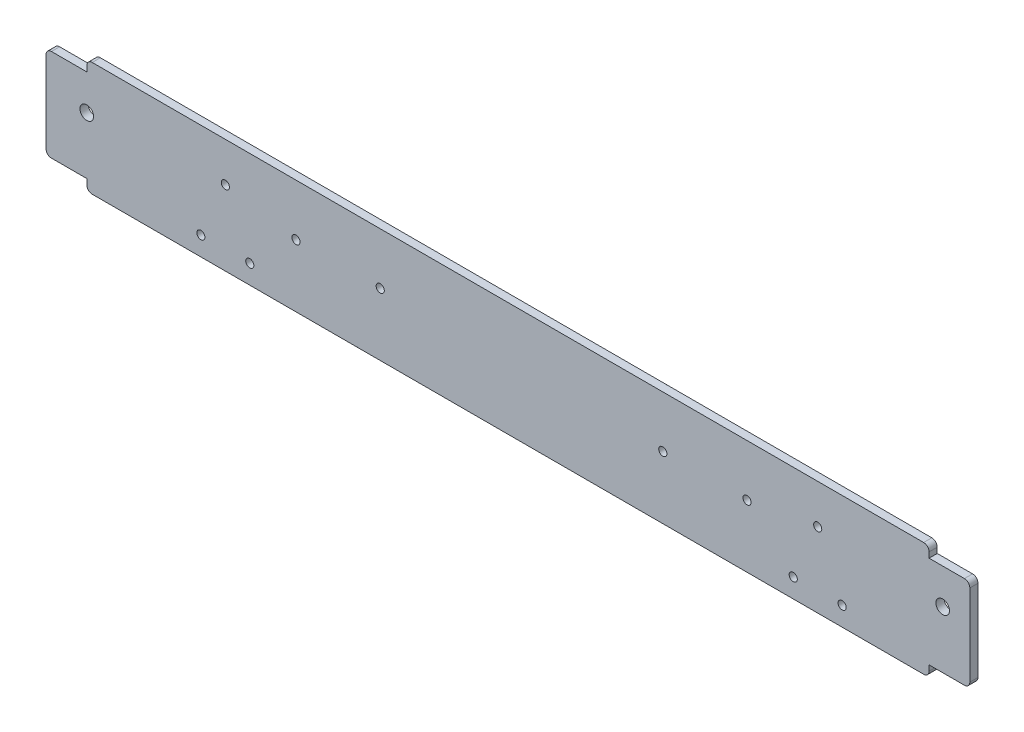
ISO-10303-21;
HEADER;
FILE_DESCRIPTION(('STEP AP214'),'2;1');
FILE_NAME('part.step','',(''),(''),'','','');
FILE_SCHEMA(('AUTOMOTIVE_DESIGN { 1 0 10303 214 1 1 1 1 }'));
ENDSEC;
DATA;
#1=APPLICATION_CONTEXT('core data for automotive mechanical design processes');
#2=APPLICATION_PROTOCOL_DEFINITION('international standard','automotive_design',2000,#1);
#3=PRODUCT_CONTEXT('',#1,'mechanical');
#4=PRODUCT('Part','Part','',(#3));
#5=PRODUCT_RELATED_PRODUCT_CATEGORY('part','',(#4));
#6=PRODUCT_DEFINITION_FORMATION('','',#4);
#7=PRODUCT_DEFINITION_CONTEXT('part definition',#1,'design');
#8=PRODUCT_DEFINITION('design','',#6,#7);
#9=PRODUCT_DEFINITION_SHAPE('','',#8);
#10=(LENGTH_UNIT() NAMED_UNIT(*) SI_UNIT(.MILLI.,.METRE.));
#11=(NAMED_UNIT(*) PLANE_ANGLE_UNIT() SI_UNIT($,.RADIAN.));
#12=(NAMED_UNIT(*) SI_UNIT($,.STERADIAN.) SOLID_ANGLE_UNIT());
#13=UNCERTAINTY_MEASURE_WITH_UNIT(LENGTH_MEASURE(1.E-05),#10,'distance_accuracy_value','');
#14=(GEOMETRIC_REPRESENTATION_CONTEXT(3) GLOBAL_UNCERTAINTY_ASSIGNED_CONTEXT((#13)) GLOBAL_UNIT_ASSIGNED_CONTEXT((#10,
#11,#12)) REPRESENTATION_CONTEXT('',''));
#15=CARTESIAN_POINT('',(0.,0.,0.));
#16=DIRECTION('',(0.,0.,1.));
#17=DIRECTION('',(1.,0.,0.));
#18=AXIS2_PLACEMENT_3D('',#15,#16,#17);
#19=CARTESIAN_POINT('',(0.,0.,3.));
#20=DIRECTION('',(0.,0.,1.));
#21=DIRECTION('',(1.,0.,0.));
#22=AXIS2_PLACEMENT_3D('',#19,#20,#21);
#23=PLANE('',#22);
#24=DIRECTION('',(0.,-1.,0.));
#25=VECTOR('',#24,1.);
#26=CARTESIAN_POINT('',(155.,17.,3.));
#27=LINE('',#26,#25);
#28=CARTESIAN_POINT('',(155.,19.,3.));
#29=VERTEX_POINT('',#28);
#30=CARTESIAN_POINT('',(155.,17.,3.));
#31=VERTEX_POINT('',#30);
#32=EDGE_CURVE('E195',#29,#31,#27,.T.);
#33=ORIENTED_EDGE('',*,*,#32,.F.);
#34=CARTESIAN_POINT('',(153.,19.,3.));
#35=DIRECTION('',(0.,0.,1.));
#36=DIRECTION('',(1.,0.,0.));
#37=AXIS2_PLACEMENT_3D('',#34,#35,#36);
#38=CIRCLE('',#37,2.);
#39=CARTESIAN_POINT('',(153.,21.,3.));
#40=VERTEX_POINT('',#39);
#41=EDGE_CURVE('E357',#29,#40,#38,.T.);
#42=ORIENTED_EDGE('',*,*,#41,.T.);
#43=DIRECTION('',(-1.,0.,0.));
#44=VECTOR('',#43,1.);
#45=CARTESIAN_POINT('',(-170.,21.,3.));
#46=LINE('',#45,#44);
#47=CARTESIAN_POINT('',(-153.,21.,3.));
#48=VERTEX_POINT('',#47);
#49=EDGE_CURVE('E321',#40,#48,#46,.T.);
#50=ORIENTED_EDGE('',*,*,#49,.T.);
#51=CARTESIAN_POINT('',(-153.,19.,3.));
#52=DIRECTION('',(0.,0.,1.));
#53=DIRECTION('',(1.,0.,0.));
#54=AXIS2_PLACEMENT_3D('',#51,#52,#53);
#55=CIRCLE('',#54,2.);
#56=CARTESIAN_POINT('',(-155.,19.,3.));
#57=VERTEX_POINT('',#56);
#58=EDGE_CURVE('E349',#48,#57,#55,.T.);
#59=ORIENTED_EDGE('',*,*,#58,.T.);
#60=DIRECTION('',(0.,-1.,0.));
#61=VECTOR('',#60,1.);
#62=CARTESIAN_POINT('',(-155.,17.,3.));
#63=LINE('',#62,#61);
#64=CARTESIAN_POINT('',(-155.,17.,3.));
#65=VERTEX_POINT('',#64);
#66=EDGE_CURVE('E224',#57,#65,#63,.T.);
#67=ORIENTED_EDGE('',*,*,#66,.T.);
#68=DIRECTION('',(-1.,0.,0.));
#69=VECTOR('',#68,1.);
#70=CARTESIAN_POINT('',(-170.,17.,3.));
#71=LINE('',#70,#69);
#72=CARTESIAN_POINT('',(-168.,17.,3.));
#73=VERTEX_POINT('',#72);
#74=EDGE_CURVE('E220',#65,#73,#71,.T.);
#75=ORIENTED_EDGE('',*,*,#74,.T.);
#76=CARTESIAN_POINT('',(-168.,15.,3.));
#77=DIRECTION('',(0.,0.,1.));
#78=DIRECTION('',(1.,0.,0.));
#79=AXIS2_PLACEMENT_3D('',#76,#77,#78);
#80=CIRCLE('',#79,2.);
#81=CARTESIAN_POINT('',(-170.,15.,3.));
#82=VERTEX_POINT('',#81);
#83=EDGE_CURVE('E347',#73,#82,#80,.T.);
#84=ORIENTED_EDGE('',*,*,#83,.T.);
#85=DIRECTION('',(0.,-1.,0.));
#86=VECTOR('',#85,1.);
#87=CARTESIAN_POINT('',(-170.,21.,3.));
#88=LINE('',#87,#86);
#89=CARTESIAN_POINT('',(-170.,-15.,3.));
#90=VERTEX_POINT('',#89);
#91=EDGE_CURVE('E325',#82,#90,#88,.T.);
#92=ORIENTED_EDGE('',*,*,#91,.T.);
#93=CARTESIAN_POINT('',(-168.,-15.,3.));
#94=DIRECTION('',(0.,0.,1.));
#95=DIRECTION('',(1.,0.,0.));
#96=AXIS2_PLACEMENT_3D('',#93,#94,#95);
#97=CIRCLE('',#96,2.);
#98=CARTESIAN_POINT('',(-168.,-17.,3.));
#99=VERTEX_POINT('',#98);
#100=EDGE_CURVE('E343',#90,#99,#97,.T.);
#101=ORIENTED_EDGE('',*,*,#100,.T.);
#102=DIRECTION('',(-1.,0.,0.));
#103=VECTOR('',#102,1.);
#104=CARTESIAN_POINT('',(-170.,-17.,3.));
#105=LINE('',#104,#103);
#106=CARTESIAN_POINT('',(-155.,-17.,3.));
#107=VERTEX_POINT('',#106);
#108=EDGE_CURVE('E236',#107,#99,#105,.T.);
#109=ORIENTED_EDGE('',*,*,#108,.F.);
#110=DIRECTION('',(0.,1.,0.));
#111=VECTOR('',#110,1.);
#112=CARTESIAN_POINT('',(-155.,-17.,3.));
#113=LINE('',#112,#111);
#114=CARTESIAN_POINT('',(-155.,-19.,3.));
#115=VERTEX_POINT('',#114);
#116=EDGE_CURVE('E232',#115,#107,#113,.T.);
#117=ORIENTED_EDGE('',*,*,#116,.F.);
#118=CARTESIAN_POINT('',(-153.,-19.,3.));
#119=DIRECTION('',(0.,0.,1.));
#120=DIRECTION('',(1.,0.,0.));
#121=AXIS2_PLACEMENT_3D('',#118,#119,#120);
#122=CIRCLE('',#121,2.);
#123=CARTESIAN_POINT('',(-153.,-21.,3.));
#124=VERTEX_POINT('',#123);
#125=EDGE_CURVE('E345',#115,#124,#122,.T.);
#126=ORIENTED_EDGE('',*,*,#125,.T.);
#127=DIRECTION('',(1.,0.,0.));
#128=VECTOR('',#127,1.);
#129=CARTESIAN_POINT('',(-170.,-21.,3.));
#130=LINE('',#129,#128);
#131=CARTESIAN_POINT('',(153.,-21.,3.));
#132=VERTEX_POINT('',#131);
#133=EDGE_CURVE('E328',#124,#132,#130,.T.);
#134=ORIENTED_EDGE('',*,*,#133,.T.);
#135=CARTESIAN_POINT('',(153.,-19.,3.));
#136=DIRECTION('',(0.,0.,1.));
#137=DIRECTION('',(1.,0.,0.));
#138=AXIS2_PLACEMENT_3D('',#135,#136,#137);
#139=CIRCLE('',#138,2.);
#140=CARTESIAN_POINT('',(155.,-19.,3.));
#141=VERTEX_POINT('',#140);
#142=EDGE_CURVE('E351',#132,#141,#139,.T.);
#143=ORIENTED_EDGE('',*,*,#142,.T.);
#144=DIRECTION('',(0.,1.,0.));
#145=VECTOR('',#144,1.);
#146=CARTESIAN_POINT('',(155.,-17.,3.));
#147=LINE('',#146,#145);
#148=CARTESIAN_POINT('',(155.,-17.,3.));
#149=VERTEX_POINT('',#148);
#150=EDGE_CURVE('E212',#141,#149,#147,.T.);
#151=ORIENTED_EDGE('',*,*,#150,.T.);
#152=DIRECTION('',(1.,0.,0.));
#153=VECTOR('',#152,1.);
#154=CARTESIAN_POINT('',(170.,-17.,3.));
#155=LINE('',#154,#153);
#156=CARTESIAN_POINT('',(168.,-17.,3.));
#157=VERTEX_POINT('',#156);
#158=EDGE_CURVE('E199',#149,#157,#155,.T.);
#159=ORIENTED_EDGE('',*,*,#158,.T.);
#160=CARTESIAN_POINT('',(168.,-15.,3.));
#161=DIRECTION('',(0.,0.,1.));
#162=DIRECTION('',(1.,0.,0.));
#163=AXIS2_PLACEMENT_3D('',#160,#161,#162);
#164=CIRCLE('',#163,2.);
#165=CARTESIAN_POINT('',(170.,-15.,3.));
#166=VERTEX_POINT('',#165);
#167=EDGE_CURVE('E353',#157,#166,#164,.T.);
#168=ORIENTED_EDGE('',*,*,#167,.T.);
#169=DIRECTION('',(0.,1.,0.));
#170=VECTOR('',#169,1.);
#171=CARTESIAN_POINT('',(170.,21.,3.));
#172=LINE('',#171,#170);
#173=CARTESIAN_POINT('',(170.,15.,3.));
#174=VERTEX_POINT('',#173);
#175=EDGE_CURVE('E318',#166,#174,#172,.T.);
#176=ORIENTED_EDGE('',*,*,#175,.T.);
#177=CARTESIAN_POINT('',(168.,15.,3.));
#178=DIRECTION('',(0.,0.,1.));
#179=DIRECTION('',(1.,0.,0.));
#180=AXIS2_PLACEMENT_3D('',#177,#178,#179);
#181=CIRCLE('',#180,2.);
#182=CARTESIAN_POINT('',(168.,17.,3.));
#183=VERTEX_POINT('',#182);
#184=EDGE_CURVE('E355',#174,#183,#181,.T.);
#185=ORIENTED_EDGE('',*,*,#184,.T.);
#186=DIRECTION('',(1.,0.,0.));
#187=VECTOR('',#186,1.);
#188=CARTESIAN_POINT('',(170.,17.,3.));
#189=LINE('',#188,#187);
#190=EDGE_CURVE('E189',#31,#183,#189,.T.);
#191=ORIENTED_EDGE('',*,*,#190,.F.);
#192=EDGE_LOOP('',(#33,#42,#50,#59,#67,#75,#84,#92,#101,#109,#117,#126,#134,#143,#151,#159,#168,
#176,#185,#191));
#193=FACE_BOUND('',#192,.T.);
#194=CARTESIAN_POINT('',(105.,-14.,3.));
#195=DIRECTION('',(0.,0.,1.));
#196=DIRECTION('',(1.,0.,0.));
#197=AXIS2_PLACEMENT_3D('',#194,#195,#196);
#198=CIRCLE('',#197,1.5);
#199=CARTESIAN_POINT('',(106.5,-14.,3.));
#200=VERTEX_POINT('',#199);
#201=EDGE_CURVE('E252',#200,#200,#198,.T.);
#202=ORIENTED_EDGE('',*,*,#201,.F.);
#203=EDGE_LOOP('',(#202));
#204=FACE_BOUND('',#203,.T.);
#205=CARTESIAN_POINT('',(160.,4.,3.));
#206=DIRECTION('',(0.,0.,1.));
#207=DIRECTION('',(1.,0.,0.));
#208=AXIS2_PLACEMENT_3D('',#205,#206,#207);
#209=CIRCLE('',#208,2.5);
#210=CARTESIAN_POINT('',(162.5,4.,3.));
#211=VERTEX_POINT('',#210);
#212=EDGE_CURVE('E264',#211,#211,#209,.T.);
#213=ORIENTED_EDGE('',*,*,#212,.F.);
#214=EDGE_LOOP('',(#213));
#215=FACE_BOUND('',#214,.T.);
#216=CARTESIAN_POINT('',(-95.,-14.,3.));
#217=DIRECTION('',(0.,0.,1.));
#218=DIRECTION('',(1.,0.,0.));
#219=AXIS2_PLACEMENT_3D('',#216,#217,#218);
#220=CIRCLE('',#219,1.5);
#221=CARTESIAN_POINT('',(-93.5,-14.,3.));
#222=VERTEX_POINT('',#221);
#223=EDGE_CURVE('E276',#222,#222,#220,.T.);
#224=ORIENTED_EDGE('',*,*,#223,.F.);
#225=EDGE_LOOP('',(#224));
#226=FACE_BOUND('',#225,.T.);
#227=CARTESIAN_POINT('',(-104.,6.5,3.));
#228=DIRECTION('',(0.,0.,1.));
#229=DIRECTION('',(1.,0.,0.));
#230=AXIS2_PLACEMENT_3D('',#227,#228,#229);
#231=CIRCLE('',#230,1.5);
#232=CARTESIAN_POINT('',(-102.5,6.5,3.));
#233=VERTEX_POINT('',#232);
#234=EDGE_CURVE('E288',#233,#233,#231,.T.);
#235=ORIENTED_EDGE('',*,*,#234,.F.);
#236=EDGE_LOOP('',(#235));
#237=FACE_BOUND('',#236,.T.);
#238=CARTESIAN_POINT('',(-47.,2.,3.));
#239=DIRECTION('',(0.,0.,1.));
#240=DIRECTION('',(1.,0.,0.));
#241=AXIS2_PLACEMENT_3D('',#238,#239,#240);
#242=CIRCLE('',#241,1.5);
#243=CARTESIAN_POINT('',(-45.5,2.,3.));
#244=VERTEX_POINT('',#243);
#245=EDGE_CURVE('E300',#244,#244,#242,.T.);
#246=ORIENTED_EDGE('',*,*,#245,.F.);
#247=EDGE_LOOP('',(#246));
#248=FACE_BOUND('',#247,.T.);
#249=CARTESIAN_POINT('',(88.,2.00000000000001,3.));
#250=DIRECTION('',(0.,0.,1.));
#251=DIRECTION('',(1.,0.,0.));
#252=AXIS2_PLACEMENT_3D('',#249,#250,#251);
#253=CIRCLE('',#252,1.5);
#254=CARTESIAN_POINT('',(89.5,2.00000000000001,3.));
#255=VERTEX_POINT('',#254);
#256=EDGE_CURVE('E312',#255,#255,#253,.T.);
#257=ORIENTED_EDGE('',*,*,#256,.F.);
#258=EDGE_LOOP('',(#257));
#259=FACE_BOUND('',#258,.T.);
#260=CARTESIAN_POINT('',(57.,2.00000000000001,3.));
#261=DIRECTION('',(0.,0.,1.));
#262=DIRECTION('',(1.,0.,0.));
#263=AXIS2_PLACEMENT_3D('',#260,#261,#262);
#264=CIRCLE('',#263,1.5);
#265=CARTESIAN_POINT('',(58.5,2.00000000000001,3.));
#266=VERTEX_POINT('',#265);
#267=EDGE_CURVE('E306',#266,#266,#264,.T.);
#268=ORIENTED_EDGE('',*,*,#267,.F.);
#269=EDGE_LOOP('',(#268));
#270=FACE_BOUND('',#269,.T.);
#271=CARTESIAN_POINT('',(-78.,2.,3.));
#272=DIRECTION('',(0.,0.,1.));
#273=DIRECTION('',(1.,0.,0.));
#274=AXIS2_PLACEMENT_3D('',#271,#272,#273);
#275=CIRCLE('',#274,1.5);
#276=CARTESIAN_POINT('',(-76.5,2.,3.));
#277=VERTEX_POINT('',#276);
#278=EDGE_CURVE('E294',#277,#277,#275,.T.);
#279=ORIENTED_EDGE('',*,*,#278,.F.);
#280=EDGE_LOOP('',(#279));
#281=FACE_BOUND('',#280,.T.);
#282=CARTESIAN_POINT('',(-113.,-14.,3.));
#283=DIRECTION('',(0.,0.,1.));
#284=DIRECTION('',(1.,0.,0.));
#285=AXIS2_PLACEMENT_3D('',#282,#283,#284);
#286=CIRCLE('',#285,1.5);
#287=CARTESIAN_POINT('',(-111.5,-14.,3.));
#288=VERTEX_POINT('',#287);
#289=EDGE_CURVE('E282',#288,#288,#286,.T.);
#290=ORIENTED_EDGE('',*,*,#289,.F.);
#291=EDGE_LOOP('',(#290));
#292=FACE_BOUND('',#291,.T.);
#293=CARTESIAN_POINT('',(-155.,4.,3.));
#294=DIRECTION('',(0.,0.,1.));
#295=DIRECTION('',(1.,0.,0.));
#296=AXIS2_PLACEMENT_3D('',#293,#294,#295);
#297=CIRCLE('',#296,2.5);
#298=CARTESIAN_POINT('',(-152.5,4.,3.));
#299=VERTEX_POINT('',#298);
#300=EDGE_CURVE('E270',#299,#299,#297,.T.);
#301=ORIENTED_EDGE('',*,*,#300,.F.);
#302=EDGE_LOOP('',(#301));
#303=FACE_BOUND('',#302,.T.);
#304=CARTESIAN_POINT('',(114.,6.5,3.));
#305=DIRECTION('',(0.,0.,1.));
#306=DIRECTION('',(1.,0.,0.));
#307=AXIS2_PLACEMENT_3D('',#304,#305,#306);
#308=CIRCLE('',#307,1.5);
#309=CARTESIAN_POINT('',(115.5,6.5,3.));
#310=VERTEX_POINT('',#309);
#311=EDGE_CURVE('E258',#310,#310,#308,.T.);
#312=ORIENTED_EDGE('',*,*,#311,.F.);
#313=EDGE_LOOP('',(#312));
#314=FACE_BOUND('',#313,.T.);
#315=CARTESIAN_POINT('',(123.,-14.,3.));
#316=DIRECTION('',(0.,0.,1.));
#317=DIRECTION('',(1.,0.,0.));
#318=AXIS2_PLACEMENT_3D('',#315,#316,#317);
#319=CIRCLE('',#318,1.5);
#320=CARTESIAN_POINT('',(124.5,-14.,3.));
#321=VERTEX_POINT('',#320);
#322=EDGE_CURVE('E246',#321,#321,#319,.T.);
#323=ORIENTED_EDGE('',*,*,#322,.F.);
#324=EDGE_LOOP('',(#323));
#325=FACE_BOUND('',#324,.T.);
#326=ADVANCED_FACE('F39',(#193,#204,#215,#226,#237,#248,#259,#270,#281,#292,#303,#314,#325),#23,.T.);
#327=CARTESIAN_POINT('',(0.,0.,0.));
#328=DIRECTION('',(0.,0.,1.));
#329=DIRECTION('',(1.,0.,0.));
#330=AXIS2_PLACEMENT_3D('',#327,#328,#329);
#331=PLANE('',#330);
#332=CARTESIAN_POINT('',(88.,2.00000000000001,0.));
#333=DIRECTION('',(0.,0.,1.));
#334=DIRECTION('',(1.,0.,0.));
#335=AXIS2_PLACEMENT_3D('',#332,#333,#334);
#336=CIRCLE('',#335,1.5);
#337=CARTESIAN_POINT('',(89.5,2.00000000000001,0.));
#338=VERTEX_POINT('',#337);
#339=EDGE_CURVE('E309',#338,#338,#336,.T.);
#340=ORIENTED_EDGE('',*,*,#339,.T.);
#341=EDGE_LOOP('',(#340));
#342=FACE_BOUND('',#341,.T.);
#343=CARTESIAN_POINT('',(57.,2.00000000000001,0.));
#344=DIRECTION('',(0.,0.,1.));
#345=DIRECTION('',(1.,0.,0.));
#346=AXIS2_PLACEMENT_3D('',#343,#344,#345);
#347=CIRCLE('',#346,1.5);
#348=CARTESIAN_POINT('',(58.5,2.00000000000001,0.));
#349=VERTEX_POINT('',#348);
#350=EDGE_CURVE('E303',#349,#349,#347,.T.);
#351=ORIENTED_EDGE('',*,*,#350,.T.);
#352=EDGE_LOOP('',(#351));
#353=FACE_BOUND('',#352,.T.);
#354=CARTESIAN_POINT('',(-47.,2.,0.));
#355=DIRECTION('',(0.,0.,1.));
#356=DIRECTION('',(1.,0.,0.));
#357=AXIS2_PLACEMENT_3D('',#354,#355,#356);
#358=CIRCLE('',#357,1.5);
#359=CARTESIAN_POINT('',(-45.5,2.,0.));
#360=VERTEX_POINT('',#359);
#361=EDGE_CURVE('E297',#360,#360,#358,.T.);
#362=ORIENTED_EDGE('',*,*,#361,.T.);
#363=EDGE_LOOP('',(#362));
#364=FACE_BOUND('',#363,.T.);
#365=CARTESIAN_POINT('',(-78.,2.,0.));
#366=DIRECTION('',(0.,0.,1.));
#367=DIRECTION('',(1.,0.,0.));
#368=AXIS2_PLACEMENT_3D('',#365,#366,#367);
#369=CIRCLE('',#368,1.5);
#370=CARTESIAN_POINT('',(-76.5,2.,0.));
#371=VERTEX_POINT('',#370);
#372=EDGE_CURVE('E291',#371,#371,#369,.T.);
#373=ORIENTED_EDGE('',*,*,#372,.T.);
#374=EDGE_LOOP('',(#373));
#375=FACE_BOUND('',#374,.T.);
#376=CARTESIAN_POINT('',(-104.,6.5,0.));
#377=DIRECTION('',(0.,0.,1.));
#378=DIRECTION('',(1.,0.,0.));
#379=AXIS2_PLACEMENT_3D('',#376,#377,#378);
#380=CIRCLE('',#379,1.5);
#381=CARTESIAN_POINT('',(-102.5,6.5,0.));
#382=VERTEX_POINT('',#381);
#383=EDGE_CURVE('E285',#382,#382,#380,.T.);
#384=ORIENTED_EDGE('',*,*,#383,.T.);
#385=EDGE_LOOP('',(#384));
#386=FACE_BOUND('',#385,.T.);
#387=CARTESIAN_POINT('',(-113.,-14.,0.));
#388=DIRECTION('',(0.,0.,1.));
#389=DIRECTION('',(1.,0.,0.));
#390=AXIS2_PLACEMENT_3D('',#387,#388,#389);
#391=CIRCLE('',#390,1.5);
#392=CARTESIAN_POINT('',(-111.5,-14.,0.));
#393=VERTEX_POINT('',#392);
#394=EDGE_CURVE('E279',#393,#393,#391,.T.);
#395=ORIENTED_EDGE('',*,*,#394,.T.);
#396=EDGE_LOOP('',(#395));
#397=FACE_BOUND('',#396,.T.);
#398=CARTESIAN_POINT('',(-95.,-14.,0.));
#399=DIRECTION('',(0.,0.,1.));
#400=DIRECTION('',(1.,0.,0.));
#401=AXIS2_PLACEMENT_3D('',#398,#399,#400);
#402=CIRCLE('',#401,1.5);
#403=CARTESIAN_POINT('',(-93.5,-14.,0.));
#404=VERTEX_POINT('',#403);
#405=EDGE_CURVE('E273',#404,#404,#402,.T.);
#406=ORIENTED_EDGE('',*,*,#405,.T.);
#407=EDGE_LOOP('',(#406));
#408=FACE_BOUND('',#407,.T.);
#409=CARTESIAN_POINT('',(-155.,4.,0.));
#410=DIRECTION('',(0.,0.,1.));
#411=DIRECTION('',(1.,0.,0.));
#412=AXIS2_PLACEMENT_3D('',#409,#410,#411);
#413=CIRCLE('',#412,2.5);
#414=CARTESIAN_POINT('',(-152.5,4.,0.));
#415=VERTEX_POINT('',#414);
#416=EDGE_CURVE('E267',#415,#415,#413,.T.);
#417=ORIENTED_EDGE('',*,*,#416,.T.);
#418=EDGE_LOOP('',(#417));
#419=FACE_BOUND('',#418,.T.);
#420=CARTESIAN_POINT('',(160.,4.,0.));
#421=DIRECTION('',(0.,0.,1.));
#422=DIRECTION('',(1.,0.,0.));
#423=AXIS2_PLACEMENT_3D('',#420,#421,#422);
#424=CIRCLE('',#423,2.5);
#425=CARTESIAN_POINT('',(162.5,4.,0.));
#426=VERTEX_POINT('',#425);
#427=EDGE_CURVE('E261',#426,#426,#424,.T.);
#428=ORIENTED_EDGE('',*,*,#427,.T.);
#429=EDGE_LOOP('',(#428));
#430=FACE_BOUND('',#429,.T.);
#431=CARTESIAN_POINT('',(114.,6.5,0.));
#432=DIRECTION('',(0.,0.,1.));
#433=DIRECTION('',(1.,0.,0.));
#434=AXIS2_PLACEMENT_3D('',#431,#432,#433);
#435=CIRCLE('',#434,1.5);
#436=CARTESIAN_POINT('',(115.5,6.5,0.));
#437=VERTEX_POINT('',#436);
#438=EDGE_CURVE('E255',#437,#437,#435,.T.);
#439=ORIENTED_EDGE('',*,*,#438,.T.);
#440=EDGE_LOOP('',(#439));
#441=FACE_BOUND('',#440,.T.);
#442=CARTESIAN_POINT('',(105.,-14.,0.));
#443=DIRECTION('',(0.,0.,1.));
#444=DIRECTION('',(1.,0.,0.));
#445=AXIS2_PLACEMENT_3D('',#442,#443,#444);
#446=CIRCLE('',#445,1.5);
#447=CARTESIAN_POINT('',(106.5,-14.,0.));
#448=VERTEX_POINT('',#447);
#449=EDGE_CURVE('E249',#448,#448,#446,.T.);
#450=ORIENTED_EDGE('',*,*,#449,.T.);
#451=EDGE_LOOP('',(#450));
#452=FACE_BOUND('',#451,.T.);
#453=CARTESIAN_POINT('',(123.,-14.,0.));
#454=DIRECTION('',(0.,0.,1.));
#455=DIRECTION('',(1.,0.,0.));
#456=AXIS2_PLACEMENT_3D('',#453,#454,#455);
#457=CIRCLE('',#456,1.5);
#458=CARTESIAN_POINT('',(124.5,-14.,0.));
#459=VERTEX_POINT('',#458);
#460=EDGE_CURVE('E245',#459,#459,#457,.T.);
#461=ORIENTED_EDGE('',*,*,#460,.T.);
#462=EDGE_LOOP('',(#461));
#463=FACE_BOUND('',#462,.T.);
#464=DIRECTION('',(-1.,0.,0.));
#465=VECTOR('',#464,1.);
#466=CARTESIAN_POINT('',(-170.,21.,0.));
#467=LINE('',#466,#465);
#468=CARTESIAN_POINT('',(153.,21.,0.));
#469=VERTEX_POINT('',#468);
#470=CARTESIAN_POINT('',(-153.,21.,0.));
#471=VERTEX_POINT('',#470);
#472=EDGE_CURVE('E334',#469,#471,#467,.T.);
#473=ORIENTED_EDGE('',*,*,#472,.F.);
#474=CARTESIAN_POINT('',(153.,19.,0.));
#475=DIRECTION('',(0.,0.,1.));
#476=DIRECTION('',(1.,0.,0.));
#477=AXIS2_PLACEMENT_3D('',#474,#475,#476);
#478=CIRCLE('',#477,2.);
#479=CARTESIAN_POINT('',(155.,19.,0.));
#480=VERTEX_POINT('',#479);
#481=EDGE_CURVE('E185',#469,#480,#478,.F.);
#482=ORIENTED_EDGE('',*,*,#481,.T.);
#483=DIRECTION('',(0.,-1.,0.));
#484=VECTOR('',#483,1.);
#485=CARTESIAN_POINT('',(155.,17.,0.));
#486=LINE('',#485,#484);
#487=CARTESIAN_POINT('',(155.,17.,0.));
#488=VERTEX_POINT('',#487);
#489=EDGE_CURVE('E177',#480,#488,#486,.T.);
#490=ORIENTED_EDGE('',*,*,#489,.T.);
#491=DIRECTION('',(1.,0.,0.));
#492=VECTOR('',#491,1.);
#493=CARTESIAN_POINT('',(170.,17.,0.));
#494=LINE('',#493,#492);
#495=CARTESIAN_POINT('',(168.,17.,0.));
#496=VERTEX_POINT('',#495);
#497=EDGE_CURVE('E182',#488,#496,#494,.T.);
#498=ORIENTED_EDGE('',*,*,#497,.T.);
#499=CARTESIAN_POINT('',(168.,15.,0.));
#500=DIRECTION('',(0.,0.,1.));
#501=DIRECTION('',(1.,0.,0.));
#502=AXIS2_PLACEMENT_3D('',#499,#500,#501);
#503=CIRCLE('',#502,2.);
#504=CARTESIAN_POINT('',(170.,15.,0.));
#505=VERTEX_POINT('',#504);
#506=EDGE_CURVE('E375',#496,#505,#503,.F.);
#507=ORIENTED_EDGE('',*,*,#506,.T.);
#508=DIRECTION('',(0.,1.,0.));
#509=VECTOR('',#508,1.);
#510=CARTESIAN_POINT('',(170.,21.,0.));
#511=LINE('',#510,#509);
#512=CARTESIAN_POINT('',(170.,-15.,0.));
#513=VERTEX_POINT('',#512);
#514=EDGE_CURVE('E315',#513,#505,#511,.T.);
#515=ORIENTED_EDGE('',*,*,#514,.F.);
#516=CARTESIAN_POINT('',(168.,-15.,0.));
#517=DIRECTION('',(0.,0.,1.));
#518=DIRECTION('',(1.,0.,0.));
#519=AXIS2_PLACEMENT_3D('',#516,#517,#518);
#520=CIRCLE('',#519,2.);
#521=CARTESIAN_POINT('',(168.,-17.,0.));
#522=VERTEX_POINT('',#521);
#523=EDGE_CURVE('E373',#513,#522,#520,.F.);
#524=ORIENTED_EDGE('',*,*,#523,.T.);
#525=DIRECTION('',(1.,0.,0.));
#526=VECTOR('',#525,1.);
#527=CARTESIAN_POINT('',(170.,-17.,0.));
#528=LINE('',#527,#526);
#529=CARTESIAN_POINT('',(155.,-17.,0.));
#530=VERTEX_POINT('',#529);
#531=EDGE_CURVE('E208',#530,#522,#528,.T.);
#532=ORIENTED_EDGE('',*,*,#531,.F.);
#533=DIRECTION('',(0.,1.,0.));
#534=VECTOR('',#533,1.);
#535=CARTESIAN_POINT('',(155.,-17.,0.));
#536=LINE('',#535,#534);
#537=CARTESIAN_POINT('',(155.,-19.,0.));
#538=VERTEX_POINT('',#537);
#539=EDGE_CURVE('E211',#538,#530,#536,.T.);
#540=ORIENTED_EDGE('',*,*,#539,.F.);
#541=CARTESIAN_POINT('',(153.,-19.,0.));
#542=DIRECTION('',(0.,0.,1.));
#543=DIRECTION('',(1.,0.,0.));
#544=AXIS2_PLACEMENT_3D('',#541,#542,#543);
#545=CIRCLE('',#544,2.);
#546=CARTESIAN_POINT('',(153.,-21.,0.));
#547=VERTEX_POINT('',#546);
#548=EDGE_CURVE('E371',#538,#547,#545,.F.);
#549=ORIENTED_EDGE('',*,*,#548,.T.);
#550=DIRECTION('',(1.,0.,0.));
#551=VECTOR('',#550,1.);
#552=CARTESIAN_POINT('',(-170.,-21.,0.));
#553=LINE('',#552,#551);
#554=CARTESIAN_POINT('',(-153.,-21.,0.));
#555=VERTEX_POINT('',#554);
#556=EDGE_CURVE('E322',#555,#547,#553,.T.);
#557=ORIENTED_EDGE('',*,*,#556,.F.);
#558=CARTESIAN_POINT('',(-153.,-19.,0.));
#559=DIRECTION('',(0.,0.,1.));
#560=DIRECTION('',(1.,0.,0.));
#561=AXIS2_PLACEMENT_3D('',#558,#559,#560);
#562=CIRCLE('',#561,2.);
#563=CARTESIAN_POINT('',(-155.,-19.,0.));
#564=VERTEX_POINT('',#563);
#565=EDGE_CURVE('E366',#555,#564,#562,.F.);
#566=ORIENTED_EDGE('',*,*,#565,.T.);
#567=DIRECTION('',(0.,1.,0.));
#568=VECTOR('',#567,1.);
#569=CARTESIAN_POINT('',(-155.,-17.,0.));
#570=LINE('',#569,#568);
#571=CARTESIAN_POINT('',(-155.,-17.,0.));
#572=VERTEX_POINT('',#571);
#573=EDGE_CURVE('E233',#564,#572,#570,.T.);
#574=ORIENTED_EDGE('',*,*,#573,.T.);
#575=DIRECTION('',(-1.,0.,0.));
#576=VECTOR('',#575,1.);
#577=CARTESIAN_POINT('',(-170.,-17.,0.));
#578=LINE('',#577,#576);
#579=CARTESIAN_POINT('',(-168.,-17.,0.));
#580=VERTEX_POINT('',#579);
#581=EDGE_CURVE('E235',#572,#580,#578,.T.);
#582=ORIENTED_EDGE('',*,*,#581,.T.);
#583=CARTESIAN_POINT('',(-168.,-15.,0.));
#584=DIRECTION('',(0.,0.,1.));
#585=DIRECTION('',(1.,0.,0.));
#586=AXIS2_PLACEMENT_3D('',#583,#584,#585);
#587=CIRCLE('',#586,2.);
#588=CARTESIAN_POINT('',(-170.,-15.,0.));
#589=VERTEX_POINT('',#588);
#590=EDGE_CURVE('E364',#580,#589,#587,.F.);
#591=ORIENTED_EDGE('',*,*,#590,.T.);
#592=DIRECTION('',(0.,-1.,0.));
#593=VECTOR('',#592,1.);
#594=CARTESIAN_POINT('',(-170.,21.,0.));
#595=LINE('',#594,#593);
#596=CARTESIAN_POINT('',(-170.,15.,0.));
#597=VERTEX_POINT('',#596);
#598=EDGE_CURVE('E337',#597,#589,#595,.T.);
#599=ORIENTED_EDGE('',*,*,#598,.F.);
#600=CARTESIAN_POINT('',(-168.,15.,0.));
#601=DIRECTION('',(0.,0.,1.));
#602=DIRECTION('',(1.,0.,0.));
#603=AXIS2_PLACEMENT_3D('',#600,#601,#602);
#604=CIRCLE('',#603,2.);
#605=CARTESIAN_POINT('',(-168.,17.,0.));
#606=VERTEX_POINT('',#605);
#607=EDGE_CURVE('E62',#597,#606,#604,.F.);
#608=ORIENTED_EDGE('',*,*,#607,.T.);
#609=DIRECTION('',(-1.,0.,0.));
#610=VECTOR('',#609,1.);
#611=CARTESIAN_POINT('',(-170.,17.,0.));
#612=LINE('',#611,#610);
#613=CARTESIAN_POINT('',(-155.,17.,0.));
#614=VERTEX_POINT('',#613);
#615=EDGE_CURVE('E221',#614,#606,#612,.T.);
#616=ORIENTED_EDGE('',*,*,#615,.F.);
#617=DIRECTION('',(0.,-1.,0.));
#618=VECTOR('',#617,1.);
#619=CARTESIAN_POINT('',(-155.,17.,0.));
#620=LINE('',#619,#618);
#621=CARTESIAN_POINT('',(-155.,19.,0.));
#622=VERTEX_POINT('',#621);
#623=EDGE_CURVE('E223',#622,#614,#620,.T.);
#624=ORIENTED_EDGE('',*,*,#623,.F.);
#625=CARTESIAN_POINT('',(-153.,19.,0.));
#626=DIRECTION('',(0.,0.,1.));
#627=DIRECTION('',(1.,0.,0.));
#628=AXIS2_PLACEMENT_3D('',#625,#626,#627);
#629=CIRCLE('',#628,2.);
#630=EDGE_CURVE('E369',#622,#471,#629,.F.);
#631=ORIENTED_EDGE('',*,*,#630,.T.);
#632=EDGE_LOOP('',(#473,#482,#490,#498,#507,#515,#524,#532,#540,#549,#557,#566,#574,#582,#591,
#599,#608,#616,#624,#631));
#633=FACE_BOUND('',#632,.T.);
#634=ADVANCED_FACE('F180',(#342,#353,#364,#375,#386,#397,#408,#419,#430,#441,#452,#463,#633),
#331,.F.);
#635=CARTESIAN_POINT('',(170.,21.,3.));
#636=DIRECTION('',(-1.,0.,0.));
#637=DIRECTION('',(0.,0.,1.));
#638=AXIS2_PLACEMENT_3D('',#635,#636,#637);
#639=PLANE('',#638);
#640=ORIENTED_EDGE('',*,*,#514,.T.);
#641=DIRECTION('',(0.,0.,1.));
#642=VECTOR('',#641,1.);
#643=CARTESIAN_POINT('',(170.,15.,3.));
#644=LINE('',#643,#642);
#645=EDGE_CURVE('E380',#505,#174,#644,.T.);
#646=ORIENTED_EDGE('',*,*,#645,.T.);
#647=ORIENTED_EDGE('',*,*,#175,.F.);
#648=DIRECTION('',(0.,0.,1.));
#649=VECTOR('',#648,1.);
#650=CARTESIAN_POINT('',(170.,-15.,0.));
#651=LINE('',#650,#649);
#652=EDGE_CURVE('E378',#166,#513,#651,.F.);
#653=ORIENTED_EDGE('',*,*,#652,.T.);
#654=EDGE_LOOP('',(#640,#646,#647,#653));
#655=FACE_BOUND('',#654,.T.);
#656=ADVANCED_FACE('F462',(#655),#639,.F.);
#657=CARTESIAN_POINT('',(-170.,-21.,3.));
#658=DIRECTION('',(0.,1.,0.));
#659=DIRECTION('',(0.,0.,1.));
#660=AXIS2_PLACEMENT_3D('',#657,#658,#659);
#661=PLANE('',#660);
#662=ORIENTED_EDGE('',*,*,#556,.T.);
#663=DIRECTION('',(0.,0.,1.));
#664=VECTOR('',#663,1.);
#665=CARTESIAN_POINT('',(153.,-21.,3.));
#666=LINE('',#665,#664);
#667=EDGE_CURVE('E389',#547,#132,#666,.T.);
#668=ORIENTED_EDGE('',*,*,#667,.T.);
#669=ORIENTED_EDGE('',*,*,#133,.F.);
#670=DIRECTION('',(0.,0.,1.));
#671=VECTOR('',#670,1.);
#672=CARTESIAN_POINT('',(-153.,-21.,3.));
#673=LINE('',#672,#671);
#674=EDGE_CURVE('E387',#124,#555,#673,.F.);
#675=ORIENTED_EDGE('',*,*,#674,.T.);
#676=EDGE_LOOP('',(#662,#668,#669,#675));
#677=FACE_BOUND('',#676,.T.);
#678=ADVANCED_FACE('F469',(#677),#661,.F.);
#679=CARTESIAN_POINT('',(-170.,21.,3.));
#680=DIRECTION('',(0.,-1.,0.));
#681=DIRECTION('',(0.,0.,-1.));
#682=AXIS2_PLACEMENT_3D('',#679,#680,#681);
#683=PLANE('',#682);
#684=ORIENTED_EDGE('',*,*,#49,.F.);
#685=DIRECTION('',(0.,0.,1.));
#686=VECTOR('',#685,1.);
#687=CARTESIAN_POINT('',(153.,21.,3.));
#688=LINE('',#687,#686);
#689=EDGE_CURVE('E362',#40,#469,#688,.F.);
#690=ORIENTED_EDGE('',*,*,#689,.T.);
#691=ORIENTED_EDGE('',*,*,#472,.T.);
#692=DIRECTION('',(0.,0.,1.));
#693=VECTOR('',#692,1.);
#694=CARTESIAN_POINT('',(-153.,21.,3.));
#695=LINE('',#694,#693);
#696=EDGE_CURVE('E359',#471,#48,#695,.T.);
#697=ORIENTED_EDGE('',*,*,#696,.T.);
#698=EDGE_LOOP('',(#684,#690,#691,#697));
#699=FACE_BOUND('',#698,.T.);
#700=ADVANCED_FACE('F440',(#699),#683,.F.);
#701=CARTESIAN_POINT('',(-170.,21.,3.));
#702=DIRECTION('',(1.,0.,0.));
#703=DIRECTION('',(0.,0.,-1.));
#704=AXIS2_PLACEMENT_3D('',#701,#702,#703);
#705=PLANE('',#704);
#706=ORIENTED_EDGE('',*,*,#91,.F.);
#707=DIRECTION('',(0.,0.,1.));
#708=VECTOR('',#707,1.);
#709=CARTESIAN_POINT('',(-170.,15.,0.));
#710=LINE('',#709,#708);
#711=EDGE_CURVE('E401',#82,#597,#710,.F.);
#712=ORIENTED_EDGE('',*,*,#711,.T.);
#713=ORIENTED_EDGE('',*,*,#598,.T.);
#714=DIRECTION('',(0.,0.,1.));
#715=VECTOR('',#714,1.);
#716=CARTESIAN_POINT('',(-170.,-15.,3.));
#717=LINE('',#716,#715);
#718=EDGE_CURVE('E398',#589,#90,#717,.T.);
#719=ORIENTED_EDGE('',*,*,#718,.T.);
#720=EDGE_LOOP('',(#706,#712,#713,#719));
#721=FACE_BOUND('',#720,.T.);
#722=ADVANCED_FACE('F424',(#721),#705,.F.);
#723=CARTESIAN_POINT('',(88.,2.00000000000001,3.));
#724=DIRECTION('',(0.,0.,-1.));
#725=DIRECTION('',(-1.,0.,0.));
#726=AXIS2_PLACEMENT_3D('',#723,#724,#725);
#727=CYLINDRICAL_SURFACE('',#726,1.5);
#728=ORIENTED_EDGE('',*,*,#256,.T.);
#729=EDGE_LOOP('',(#728));
#730=FACE_BOUND('',#729,.T.);
#731=ORIENTED_EDGE('',*,*,#339,.F.);
#732=EDGE_LOOP('',(#731));
#733=FACE_BOUND('',#732,.T.);
#734=ADVANCED_FACE('F466',(#730,#733),#727,.F.);
#735=CARTESIAN_POINT('',(57.,2.00000000000001,3.));
#736=DIRECTION('',(0.,0.,-1.));
#737=DIRECTION('',(-1.,0.,0.));
#738=AXIS2_PLACEMENT_3D('',#735,#736,#737);
#739=CYLINDRICAL_SURFACE('',#738,1.5);
#740=ORIENTED_EDGE('',*,*,#267,.T.);
#741=EDGE_LOOP('',(#740));
#742=FACE_BOUND('',#741,.T.);
#743=ORIENTED_EDGE('',*,*,#350,.F.);
#744=EDGE_LOOP('',(#743));
#745=FACE_BOUND('',#744,.T.);
#746=ADVANCED_FACE('F731',(#742,#745),#739,.F.);
#747=CARTESIAN_POINT('',(-47.,2.,3.));
#748=DIRECTION('',(0.,0.,-1.));
#749=DIRECTION('',(-1.,0.,0.));
#750=AXIS2_PLACEMENT_3D('',#747,#748,#749);
#751=CYLINDRICAL_SURFACE('',#750,1.5);
#752=ORIENTED_EDGE('',*,*,#245,.T.);
#753=EDGE_LOOP('',(#752));
#754=FACE_BOUND('',#753,.T.);
#755=ORIENTED_EDGE('',*,*,#361,.F.);
#756=EDGE_LOOP('',(#755));
#757=FACE_BOUND('',#756,.T.);
#758=ADVANCED_FACE('F722',(#754,#757),#751,.F.);
#759=CARTESIAN_POINT('',(-78.,2.,3.));
#760=DIRECTION('',(0.,0.,-1.));
#761=DIRECTION('',(-1.,0.,0.));
#762=AXIS2_PLACEMENT_3D('',#759,#760,#761);
#763=CYLINDRICAL_SURFACE('',#762,1.5);
#764=ORIENTED_EDGE('',*,*,#278,.T.);
#765=EDGE_LOOP('',(#764));
#766=FACE_BOUND('',#765,.T.);
#767=ORIENTED_EDGE('',*,*,#372,.F.);
#768=EDGE_LOOP('',(#767));
#769=FACE_BOUND('',#768,.T.);
#770=ADVANCED_FACE('F713',(#766,#769),#763,.F.);
#771=CARTESIAN_POINT('',(-104.,6.5,3.));
#772=DIRECTION('',(0.,0.,-1.));
#773=DIRECTION('',(-1.,0.,0.));
#774=AXIS2_PLACEMENT_3D('',#771,#772,#773);
#775=CYLINDRICAL_SURFACE('',#774,1.5);
#776=ORIENTED_EDGE('',*,*,#234,.T.);
#777=EDGE_LOOP('',(#776));
#778=FACE_BOUND('',#777,.T.);
#779=ORIENTED_EDGE('',*,*,#383,.F.);
#780=EDGE_LOOP('',(#779));
#781=FACE_BOUND('',#780,.T.);
#782=ADVANCED_FACE('F704',(#778,#781),#775,.F.);
#783=CARTESIAN_POINT('',(-113.,-14.,3.));
#784=DIRECTION('',(0.,0.,-1.));
#785=DIRECTION('',(-1.,0.,0.));
#786=AXIS2_PLACEMENT_3D('',#783,#784,#785);
#787=CYLINDRICAL_SURFACE('',#786,1.5);
#788=ORIENTED_EDGE('',*,*,#289,.T.);
#789=EDGE_LOOP('',(#788));
#790=FACE_BOUND('',#789,.T.);
#791=ORIENTED_EDGE('',*,*,#394,.F.);
#792=EDGE_LOOP('',(#791));
#793=FACE_BOUND('',#792,.T.);
#794=ADVANCED_FACE('F695',(#790,#793),#787,.F.);
#795=CARTESIAN_POINT('',(-95.,-14.,3.));
#796=DIRECTION('',(0.,0.,-1.));
#797=DIRECTION('',(-1.,0.,0.));
#798=AXIS2_PLACEMENT_3D('',#795,#796,#797);
#799=CYLINDRICAL_SURFACE('',#798,1.5);
#800=ORIENTED_EDGE('',*,*,#223,.T.);
#801=EDGE_LOOP('',(#800));
#802=FACE_BOUND('',#801,.T.);
#803=ORIENTED_EDGE('',*,*,#405,.F.);
#804=EDGE_LOOP('',(#803));
#805=FACE_BOUND('',#804,.T.);
#806=ADVANCED_FACE('F686',(#802,#805),#799,.F.);
#807=CARTESIAN_POINT('',(-155.,4.,3.));
#808=DIRECTION('',(0.,0.,-1.));
#809=DIRECTION('',(-1.,0.,0.));
#810=AXIS2_PLACEMENT_3D('',#807,#808,#809);
#811=CYLINDRICAL_SURFACE('',#810,2.5);
#812=ORIENTED_EDGE('',*,*,#300,.T.);
#813=EDGE_LOOP('',(#812));
#814=FACE_BOUND('',#813,.T.);
#815=ORIENTED_EDGE('',*,*,#416,.F.);
#816=EDGE_LOOP('',(#815));
#817=FACE_BOUND('',#816,.T.);
#818=ADVANCED_FACE('F677',(#814,#817),#811,.F.);
#819=CARTESIAN_POINT('',(160.,4.,3.));
#820=DIRECTION('',(0.,0.,-1.));
#821=DIRECTION('',(-1.,0.,0.));
#822=AXIS2_PLACEMENT_3D('',#819,#820,#821);
#823=CYLINDRICAL_SURFACE('',#822,2.5);
#824=ORIENTED_EDGE('',*,*,#212,.T.);
#825=EDGE_LOOP('',(#824));
#826=FACE_BOUND('',#825,.T.);
#827=ORIENTED_EDGE('',*,*,#427,.F.);
#828=EDGE_LOOP('',(#827));
#829=FACE_BOUND('',#828,.T.);
#830=ADVANCED_FACE('F668',(#826,#829),#823,.F.);
#831=CARTESIAN_POINT('',(114.,6.5,3.));
#832=DIRECTION('',(0.,0.,-1.));
#833=DIRECTION('',(-1.,0.,0.));
#834=AXIS2_PLACEMENT_3D('',#831,#832,#833);
#835=CYLINDRICAL_SURFACE('',#834,1.5);
#836=ORIENTED_EDGE('',*,*,#311,.T.);
#837=EDGE_LOOP('',(#836));
#838=FACE_BOUND('',#837,.T.);
#839=ORIENTED_EDGE('',*,*,#438,.F.);
#840=EDGE_LOOP('',(#839));
#841=FACE_BOUND('',#840,.T.);
#842=ADVANCED_FACE('F659',(#838,#841),#835,.F.);
#843=CARTESIAN_POINT('',(105.,-14.,3.));
#844=DIRECTION('',(0.,0.,-1.));
#845=DIRECTION('',(-1.,0.,0.));
#846=AXIS2_PLACEMENT_3D('',#843,#844,#845);
#847=CYLINDRICAL_SURFACE('',#846,1.5);
#848=ORIENTED_EDGE('',*,*,#201,.T.);
#849=EDGE_LOOP('',(#848));
#850=FACE_BOUND('',#849,.T.);
#851=ORIENTED_EDGE('',*,*,#449,.F.);
#852=EDGE_LOOP('',(#851));
#853=FACE_BOUND('',#852,.T.);
#854=ADVANCED_FACE('F650',(#850,#853),#847,.F.);
#855=CARTESIAN_POINT('',(123.,-14.,3.));
#856=DIRECTION('',(0.,0.,-1.));
#857=DIRECTION('',(-1.,0.,0.));
#858=AXIS2_PLACEMENT_3D('',#855,#856,#857);
#859=CYLINDRICAL_SURFACE('',#858,1.5);
#860=ORIENTED_EDGE('',*,*,#322,.T.);
#861=EDGE_LOOP('',(#860));
#862=FACE_BOUND('',#861,.T.);
#863=ORIENTED_EDGE('',*,*,#460,.F.);
#864=EDGE_LOOP('',(#863));
#865=FACE_BOUND('',#864,.T.);
#866=ADVANCED_FACE('F643',(#862,#865),#859,.F.);
#867=CARTESIAN_POINT('',(-170.,-17.,0.));
#868=DIRECTION('',(0.,1.,0.));
#869=DIRECTION('',(-1.,0.,0.));
#870=AXIS2_PLACEMENT_3D('',#867,#868,#869);
#871=PLANE('',#870);
#872=ORIENTED_EDGE('',*,*,#108,.T.);
#873=DIRECTION('',(0.,0.,1.));
#874=VECTOR('',#873,1.);
#875=CARTESIAN_POINT('',(-168.,-17.,0.));
#876=LINE('',#875,#874);
#877=EDGE_CURVE('E11',#99,#580,#876,.F.);
#878=ORIENTED_EDGE('',*,*,#877,.T.);
#879=ORIENTED_EDGE('',*,*,#581,.F.);
#880=DIRECTION('',(0.,0.,1.));
#881=VECTOR('',#880,1.);
#882=CARTESIAN_POINT('',(-155.,-17.,0.));
#883=LINE('',#882,#881);
#884=EDGE_CURVE('E239',#572,#107,#883,.T.);
#885=ORIENTED_EDGE('',*,*,#884,.T.);
#886=EDGE_LOOP('',(#872,#878,#879,#885));
#887=FACE_BOUND('',#886,.T.);
#888=ADVANCED_FACE('F417',(#887),#871,.F.);
#889=CARTESIAN_POINT('',(-155.,-17.,0.));
#890=DIRECTION('',(1.,0.,0.));
#891=DIRECTION('',(0.,0.,-1.));
#892=AXIS2_PLACEMENT_3D('',#889,#890,#891);
#893=PLANE('',#892);
#894=ORIENTED_EDGE('',*,*,#573,.F.);
#895=DIRECTION('',(0.,0.,1.));
#896=VECTOR('',#895,1.);
#897=CARTESIAN_POINT('',(-155.,-19.,0.));
#898=LINE('',#897,#896);
#899=EDGE_CURVE('E47',#564,#115,#898,.T.);
#900=ORIENTED_EDGE('',*,*,#899,.T.);
#901=ORIENTED_EDGE('',*,*,#116,.T.);
#902=ORIENTED_EDGE('',*,*,#884,.F.);
#903=EDGE_LOOP('',(#894,#900,#901,#902));
#904=FACE_BOUND('',#903,.T.);
#905=ADVANCED_FACE('F407',(#904),#893,.F.);
#906=CARTESIAN_POINT('',(-155.,17.,0.));
#907=DIRECTION('',(-1.,0.,0.));
#908=DIRECTION('',(0.,0.,1.));
#909=AXIS2_PLACEMENT_3D('',#906,#907,#908);
#910=PLANE('',#909);
#911=ORIENTED_EDGE('',*,*,#66,.F.);
#912=DIRECTION('',(0.,0.,1.));
#913=VECTOR('',#912,1.);
#914=CARTESIAN_POINT('',(-155.,19.,0.));
#915=LINE('',#914,#913);
#916=EDGE_CURVE('E54',#57,#622,#915,.F.);
#917=ORIENTED_EDGE('',*,*,#916,.T.);
#918=ORIENTED_EDGE('',*,*,#623,.T.);
#919=DIRECTION('',(0.,0.,1.));
#920=VECTOR('',#919,1.);
#921=CARTESIAN_POINT('',(-155.,17.,0.));
#922=LINE('',#921,#920);
#923=EDGE_CURVE('E226',#614,#65,#922,.T.);
#924=ORIENTED_EDGE('',*,*,#923,.T.);
#925=EDGE_LOOP('',(#911,#917,#918,#924));
#926=FACE_BOUND('',#925,.T.);
#927=ADVANCED_FACE('F433',(#926),#910,.T.);
#928=CARTESIAN_POINT('',(-170.,17.,0.));
#929=DIRECTION('',(0.,1.,0.));
#930=DIRECTION('',(-1.,0.,0.));
#931=AXIS2_PLACEMENT_3D('',#928,#929,#930);
#932=PLANE('',#931);
#933=ORIENTED_EDGE('',*,*,#615,.T.);
#934=DIRECTION('',(0.,0.,1.));
#935=VECTOR('',#934,1.);
#936=CARTESIAN_POINT('',(-168.,17.,3.));
#937=LINE('',#936,#935);
#938=EDGE_CURVE('E395',#606,#73,#937,.T.);
#939=ORIENTED_EDGE('',*,*,#938,.T.);
#940=ORIENTED_EDGE('',*,*,#74,.F.);
#941=ORIENTED_EDGE('',*,*,#923,.F.);
#942=EDGE_LOOP('',(#933,#939,#940,#941));
#943=FACE_BOUND('',#942,.T.);
#944=ADVANCED_FACE('F431',(#943),#932,.T.);
#945=CARTESIAN_POINT('',(155.,-17.,0.));
#946=DIRECTION('',(1.,0.,0.));
#947=DIRECTION('',(0.,0.,-1.));
#948=AXIS2_PLACEMENT_3D('',#945,#946,#947);
#949=PLANE('',#948);
#950=ORIENTED_EDGE('',*,*,#150,.F.);
#951=DIRECTION('',(0.,0.,1.));
#952=VECTOR('',#951,1.);
#953=CARTESIAN_POINT('',(155.,-19.,0.));
#954=LINE('',#953,#952);
#955=EDGE_CURVE('E392',#141,#538,#954,.F.);
#956=ORIENTED_EDGE('',*,*,#955,.T.);
#957=ORIENTED_EDGE('',*,*,#539,.T.);
#958=DIRECTION('',(0.,0.,1.));
#959=VECTOR('',#958,1.);
#960=CARTESIAN_POINT('',(155.,-17.,0.));
#961=LINE('',#960,#959);
#962=EDGE_CURVE('E214',#530,#149,#961,.T.);
#963=ORIENTED_EDGE('',*,*,#962,.T.);
#964=EDGE_LOOP('',(#950,#956,#957,#963));
#965=FACE_BOUND('',#964,.T.);
#966=ADVANCED_FACE('F495',(#965),#949,.T.);
#967=CARTESIAN_POINT('',(170.,-17.,0.));
#968=DIRECTION('',(0.,-1.,0.));
#969=DIRECTION('',(1.,0.,0.));
#970=AXIS2_PLACEMENT_3D('',#967,#968,#969);
#971=PLANE('',#970);
#972=ORIENTED_EDGE('',*,*,#531,.T.);
#973=DIRECTION('',(0.,0.,1.));
#974=VECTOR('',#973,1.);
#975=CARTESIAN_POINT('',(168.,-17.,3.));
#976=LINE('',#975,#974);
#977=EDGE_CURVE('E384',#522,#157,#976,.T.);
#978=ORIENTED_EDGE('',*,*,#977,.T.);
#979=ORIENTED_EDGE('',*,*,#158,.F.);
#980=ORIENTED_EDGE('',*,*,#962,.F.);
#981=EDGE_LOOP('',(#972,#978,#979,#980));
#982=FACE_BOUND('',#981,.T.);
#983=ADVANCED_FACE('F491',(#982),#971,.T.);
#984=CARTESIAN_POINT('',(170.,17.,0.));
#985=DIRECTION('',(0.,-1.,0.));
#986=DIRECTION('',(1.,0.,0.));
#987=AXIS2_PLACEMENT_3D('',#984,#985,#986);
#988=PLANE('',#987);
#989=ORIENTED_EDGE('',*,*,#190,.T.);
#990=DIRECTION('',(0.,0.,1.));
#991=VECTOR('',#990,1.);
#992=CARTESIAN_POINT('',(168.,17.,0.));
#993=LINE('',#992,#991);
#994=EDGE_CURVE('E203',#183,#496,#993,.F.);
#995=ORIENTED_EDGE('',*,*,#994,.T.);
#996=ORIENTED_EDGE('',*,*,#497,.F.);
#997=DIRECTION('',(0.,0.,1.));
#998=VECTOR('',#997,1.);
#999=CARTESIAN_POINT('',(155.,17.,0.));
#1000=LINE('',#999,#998);
#1001=EDGE_CURVE('E192',#488,#31,#1000,.T.);
#1002=ORIENTED_EDGE('',*,*,#1001,.T.);
#1003=EDGE_LOOP('',(#989,#995,#996,#1002));
#1004=FACE_BOUND('',#1003,.T.);
#1005=ADVANCED_FACE('F201',(#1004),#988,.F.);
#1006=CARTESIAN_POINT('',(155.,17.,0.));
#1007=DIRECTION('',(-1.,0.,0.));
#1008=DIRECTION('',(0.,0.,1.));
#1009=AXIS2_PLACEMENT_3D('',#1006,#1007,#1008);
#1010=PLANE('',#1009);
#1011=ORIENTED_EDGE('',*,*,#489,.F.);
#1012=DIRECTION('',(0.,0.,1.));
#1013=VECTOR('',#1012,1.);
#1014=CARTESIAN_POINT('',(155.,19.,0.));
#1015=LINE('',#1014,#1013);
#1016=EDGE_CURVE('E331',#480,#29,#1015,.T.);
#1017=ORIENTED_EDGE('',*,*,#1016,.T.);
#1018=ORIENTED_EDGE('',*,*,#32,.T.);
#1019=ORIENTED_EDGE('',*,*,#1001,.F.);
#1020=EDGE_LOOP('',(#1011,#1017,#1018,#1019));
#1021=FACE_BOUND('',#1020,.T.);
#1022=ADVANCED_FACE('F193',(#1021),#1010,.F.);
#1023=CARTESIAN_POINT('',(153.,19.,0.));
#1024=DIRECTION('',(0.,0.,1.));
#1025=DIRECTION('',(1.,0.,0.));
#1026=AXIS2_PLACEMENT_3D('',#1023,#1024,#1025);
#1027=CYLINDRICAL_SURFACE('',#1026,2.);
#1028=ORIENTED_EDGE('',*,*,#481,.F.);
#1029=ORIENTED_EDGE('',*,*,#689,.F.);
#1030=ORIENTED_EDGE('',*,*,#41,.F.);
#1031=ORIENTED_EDGE('',*,*,#1016,.F.);
#1032=EDGE_LOOP('',(#1028,#1029,#1030,#1031));
#1033=FACE_BOUND('',#1032,.T.);
#1034=ADVANCED_FACE('F443',(#1033),#1027,.T.);
#1035=CARTESIAN_POINT('',(168.,15.,3.));
#1036=DIRECTION('',(0.,0.,1.));
#1037=DIRECTION('',(1.,0.,0.));
#1038=AXIS2_PLACEMENT_3D('',#1035,#1036,#1037);
#1039=CYLINDRICAL_SURFACE('',#1038,2.);
#1040=ORIENTED_EDGE('',*,*,#506,.F.);
#1041=ORIENTED_EDGE('',*,*,#994,.F.);
#1042=ORIENTED_EDGE('',*,*,#184,.F.);
#1043=ORIENTED_EDGE('',*,*,#645,.F.);
#1044=EDGE_LOOP('',(#1040,#1041,#1042,#1043));
#1045=FACE_BOUND('',#1044,.T.);
#1046=ADVANCED_FACE('F445',(#1045),#1039,.T.);
#1047=CARTESIAN_POINT('',(168.,-15.,0.));
#1048=DIRECTION('',(0.,0.,-1.));
#1049=DIRECTION('',(-1.,0.,0.));
#1050=AXIS2_PLACEMENT_3D('',#1047,#1048,#1049);
#1051=CYLINDRICAL_SURFACE('',#1050,2.);
#1052=ORIENTED_EDGE('',*,*,#523,.F.);
#1053=ORIENTED_EDGE('',*,*,#652,.F.);
#1054=ORIENTED_EDGE('',*,*,#167,.F.);
#1055=ORIENTED_EDGE('',*,*,#977,.F.);
#1056=EDGE_LOOP('',(#1052,#1053,#1054,#1055));
#1057=FACE_BOUND('',#1056,.T.);
#1058=ADVANCED_FACE('F451',(#1057),#1051,.T.);
#1059=CARTESIAN_POINT('',(153.,-19.,3.));
#1060=DIRECTION('',(0.,0.,-1.));
#1061=DIRECTION('',(-1.,0.,0.));
#1062=AXIS2_PLACEMENT_3D('',#1059,#1060,#1061);
#1063=CYLINDRICAL_SURFACE('',#1062,2.);
#1064=ORIENTED_EDGE('',*,*,#548,.F.);
#1065=ORIENTED_EDGE('',*,*,#955,.F.);
#1066=ORIENTED_EDGE('',*,*,#142,.F.);
#1067=ORIENTED_EDGE('',*,*,#667,.F.);
#1068=EDGE_LOOP('',(#1064,#1065,#1066,#1067));
#1069=FACE_BOUND('',#1068,.T.);
#1070=ADVANCED_FACE('F501',(#1069),#1063,.T.);
#1071=CARTESIAN_POINT('',(-153.,19.,3.));
#1072=DIRECTION('',(0.,0.,-1.));
#1073=DIRECTION('',(-1.,0.,0.));
#1074=AXIS2_PLACEMENT_3D('',#1071,#1072,#1073);
#1075=CYLINDRICAL_SURFACE('',#1074,2.);
#1076=ORIENTED_EDGE('',*,*,#630,.F.);
#1077=ORIENTED_EDGE('',*,*,#916,.F.);
#1078=ORIENTED_EDGE('',*,*,#58,.F.);
#1079=ORIENTED_EDGE('',*,*,#696,.F.);
#1080=EDGE_LOOP('',(#1076,#1077,#1078,#1079));
#1081=FACE_BOUND('',#1080,.T.);
#1082=ADVANCED_FACE('F437',(#1081),#1075,.T.);
#1083=CARTESIAN_POINT('',(-168.,15.,0.));
#1084=DIRECTION('',(0.,0.,-1.));
#1085=DIRECTION('',(-1.,0.,0.));
#1086=AXIS2_PLACEMENT_3D('',#1083,#1084,#1085);
#1087=CYLINDRICAL_SURFACE('',#1086,2.);
#1088=ORIENTED_EDGE('',*,*,#607,.F.);
#1089=ORIENTED_EDGE('',*,*,#711,.F.);
#1090=ORIENTED_EDGE('',*,*,#83,.F.);
#1091=ORIENTED_EDGE('',*,*,#938,.F.);
#1092=EDGE_LOOP('',(#1088,#1089,#1090,#1091));
#1093=FACE_BOUND('',#1092,.T.);
#1094=ADVANCED_FACE('F427',(#1093),#1087,.T.);
#1095=CARTESIAN_POINT('',(-153.,-19.,0.));
#1096=DIRECTION('',(0.,0.,1.));
#1097=DIRECTION('',(1.,0.,0.));
#1098=AXIS2_PLACEMENT_3D('',#1095,#1096,#1097);
#1099=CYLINDRICAL_SURFACE('',#1098,2.);
#1100=ORIENTED_EDGE('',*,*,#565,.F.);
#1101=ORIENTED_EDGE('',*,*,#674,.F.);
#1102=ORIENTED_EDGE('',*,*,#125,.F.);
#1103=ORIENTED_EDGE('',*,*,#899,.F.);
#1104=EDGE_LOOP('',(#1100,#1101,#1102,#1103));
#1105=FACE_BOUND('',#1104,.T.);
#1106=ADVANCED_FACE('F503',(#1105),#1099,.T.);
#1107=CARTESIAN_POINT('',(-168.,-15.,3.));
#1108=DIRECTION('',(0.,0.,1.));
#1109=DIRECTION('',(1.,0.,0.));
#1110=AXIS2_PLACEMENT_3D('',#1107,#1108,#1109);
#1111=CYLINDRICAL_SURFACE('',#1110,2.);
#1112=ORIENTED_EDGE('',*,*,#590,.F.);
#1113=ORIENTED_EDGE('',*,*,#877,.F.);
#1114=ORIENTED_EDGE('',*,*,#100,.F.);
#1115=ORIENTED_EDGE('',*,*,#718,.F.);
#1116=EDGE_LOOP('',(#1112,#1113,#1114,#1115));
#1117=FACE_BOUND('',#1116,.T.);
#1118=ADVANCED_FACE('F41',(#1117),#1111,.T.);
#1119=CLOSED_SHELL('',(#326,#634,#656,#678,#700,#722,#734,#746,#758,#770,#782,#794,#806,#818,
#830,#842,#854,#866,#888,#905,#927,#944,#966,#983,#1005,#1022,#1034,#1046,#1058,#1070,#1082,
#1094,#1106,#1118));
#1120=MANIFOLD_SOLID_BREP('B2',#1119);
#1121=ADVANCED_BREP_SHAPE_REPRESENTATION('',(#18,#1120),#14);
#1122=SHAPE_DEFINITION_REPRESENTATION(#9,#1121);
ENDSEC;
END-ISO-10303-21;
